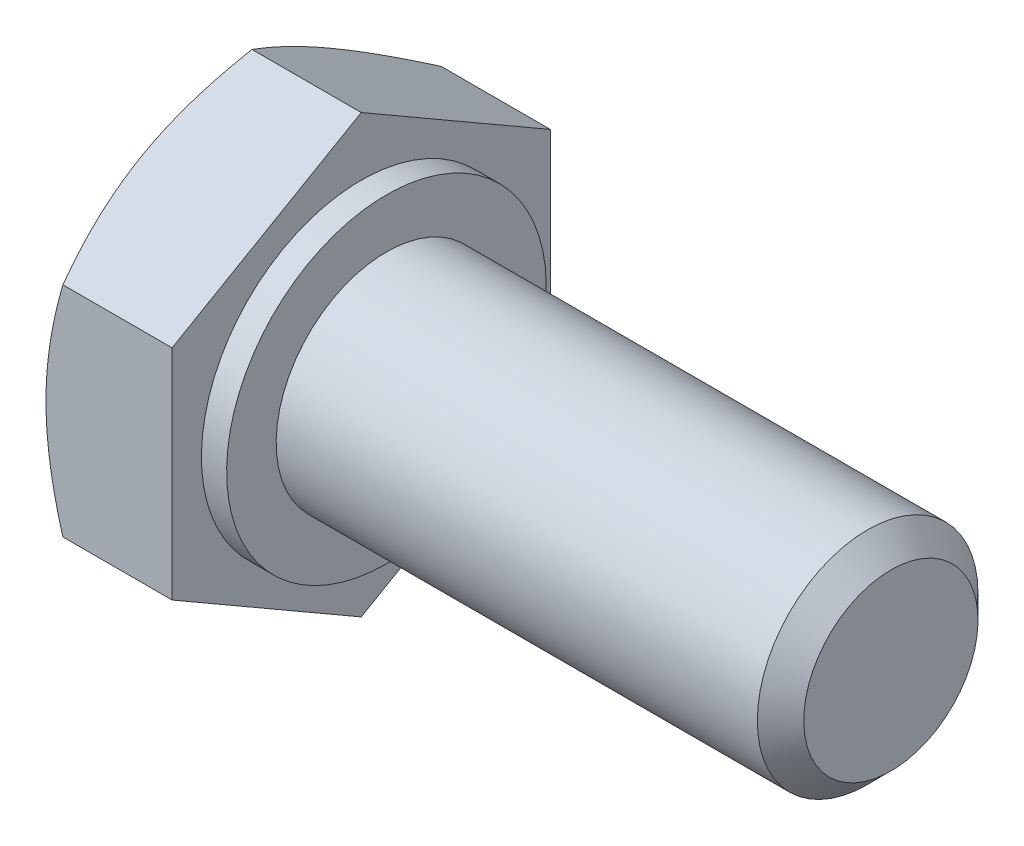
ISO-10303-21;
HEADER;
FILE_DESCRIPTION(('STEP AP214'),'2;1');
FILE_NAME('part.step','',(''),(''),'','','');
FILE_SCHEMA(('AUTOMOTIVE_DESIGN { 1 0 10303 214 1 1 1 1 }'));
ENDSEC;
DATA;
#1=APPLICATION_CONTEXT('core data for automotive mechanical design processes');
#2=APPLICATION_PROTOCOL_DEFINITION('international standard','automotive_design',2000,#1);
#3=PRODUCT_CONTEXT('',#1,'mechanical');
#4=PRODUCT('Part','Part','',(#3));
#5=PRODUCT_RELATED_PRODUCT_CATEGORY('part','',(#4));
#6=PRODUCT_DEFINITION_FORMATION('','',#4);
#7=PRODUCT_DEFINITION_CONTEXT('part definition',#1,'design');
#8=PRODUCT_DEFINITION('design','',#6,#7);
#9=PRODUCT_DEFINITION_SHAPE('','',#8);
#10=(LENGTH_UNIT() NAMED_UNIT(*) SI_UNIT(.MILLI.,.METRE.));
#11=(NAMED_UNIT(*) PLANE_ANGLE_UNIT() SI_UNIT($,.RADIAN.));
#12=(NAMED_UNIT(*) SI_UNIT($,.STERADIAN.) SOLID_ANGLE_UNIT());
#13=UNCERTAINTY_MEASURE_WITH_UNIT(LENGTH_MEASURE(1.E-05),#10,'distance_accuracy_value','');
#14=(GEOMETRIC_REPRESENTATION_CONTEXT(3) GLOBAL_UNCERTAINTY_ASSIGNED_CONTEXT((#13)) GLOBAL_UNIT_ASSIGNED_CONTEXT((#10,
#11,#12)) REPRESENTATION_CONTEXT('',''));
#15=CARTESIAN_POINT('',(0.,0.,0.));
#16=DIRECTION('',(0.,0.,1.));
#17=DIRECTION('',(1.,0.,0.));
#18=AXIS2_PLACEMENT_3D('',#15,#16,#17);
#19=CARTESIAN_POINT('',(0.,2.1425,0.));
#20=DIRECTION('',(1.,0.,0.));
#21=DIRECTION('',(0.,1.,0.));
#22=AXIS2_PLACEMENT_3D('',#19,#20,#21);
#23=PLANE('',#22);
#24=CARTESIAN_POINT('',(0.,0.,0.));
#25=DIRECTION('',(1.,0.,0.));
#26=DIRECTION('',(0.,1.,0.));
#27=AXIS2_PLACEMENT_3D('',#24,#25,#26);
#28=CIRCLE('',#27,1.75);
#29=CARTESIAN_POINT('',(0.,-1.75,0.));
#30=VERTEX_POINT('',#29);
#31=EDGE_CURVE('E218',#30,#30,#28,.T.);
#32=ORIENTED_EDGE('',*,*,#31,.F.);
#33=EDGE_LOOP('',(#32));
#34=FACE_BOUND('',#33,.T.);
#35=CARTESIAN_POINT('',(0.,0.,0.));
#36=DIRECTION('',(1.,0.,0.));
#37=DIRECTION('',(0.,1.,0.));
#38=AXIS2_PLACEMENT_3D('',#35,#36,#37);
#39=CIRCLE('',#38,2.535);
#40=CARTESIAN_POINT('',(0.,-2.535,0.));
#41=VERTEX_POINT('',#40);
#42=EDGE_CURVE('E28',#41,#41,#39,.T.);
#43=ORIENTED_EDGE('',*,*,#42,.T.);
#44=EDGE_LOOP('',(#43));
#45=FACE_BOUND('',#44,.T.);
#46=ADVANCED_FACE('F17',(#34,#45),#23,.T.);
#47=CARTESIAN_POINT('',(-0.200049999999994,0.,0.));
#48=DIRECTION('',(1.,0.,0.));
#49=DIRECTION('',(0.,1.,0.));
#50=AXIS2_PLACEMENT_3D('',#47,#48,#49);
#51=CYLINDRICAL_SURFACE('',#50,2.535);
#52=ORIENTED_EDGE('',*,*,#42,.F.);
#53=DIRECTION('',(-1.,0.,0.));
#54=VECTOR('',#53,1.);
#55=CARTESIAN_POINT('',(-0.200049999999994,-2.535,0.));
#56=LINE('',#55,#54);
#57=CARTESIAN_POINT('',(-0.400099999999995,-2.535,0.));
#58=VERTEX_POINT('',#57);
#59=EDGE_CURVE('E11',#41,#58,#56,.T.);
#60=ORIENTED_EDGE('',*,*,#59,.T.);
#61=CARTESIAN_POINT('',(-0.400099999999994,0.,0.));
#62=DIRECTION('',(1.,0.,0.));
#63=DIRECTION('',(0.,1.,0.));
#64=AXIS2_PLACEMENT_3D('',#61,#62,#63);
#65=CIRCLE('',#64,2.535);
#66=EDGE_CURVE('E206',#58,#58,#65,.T.);
#67=ORIENTED_EDGE('',*,*,#66,.T.);
#68=ORIENTED_EDGE('',*,*,#59,.F.);
#69=EDGE_LOOP('',(#52,#60,#67,#68));
#70=FACE_BOUND('',#69,.T.);
#71=ADVANCED_FACE('F390',(#70),#51,.T.);
#72=CARTESIAN_POINT('',(-2.4001,0.,0.));
#73=DIRECTION('',(1.,0.,0.));
#74=DIRECTION('',(0.,1.,0.));
#75=AXIS2_PLACEMENT_3D('',#72,#73,#74);
#76=PLANE('',#75);
#77=CARTESIAN_POINT('',(-2.4001,0.,0.));
#78=DIRECTION('',(-1.,0.,0.));
#79=DIRECTION('',(0.,1.,0.));
#80=AXIS2_PLACEMENT_3D('',#77,#78,#79);
#81=CIRCLE('',#80,3.);
#82=CARTESIAN_POINT('',(-2.4001,0.,3.));
#83=VERTEX_POINT('',#82);
#84=CARTESIAN_POINT('',(-2.4001,2.59807621135331,1.5));
#85=VERTEX_POINT('',#84);
#86=EDGE_CURVE('E303',#83,#85,#81,.T.);
#87=ORIENTED_EDGE('',*,*,#86,.T.);
#88=CARTESIAN_POINT('',(-2.4001,0.,0.));
#89=DIRECTION('',(-1.,0.,0.));
#90=DIRECTION('',(0.,1.,0.));
#91=AXIS2_PLACEMENT_3D('',#88,#89,#90);
#92=CIRCLE('',#91,3.);
#93=CARTESIAN_POINT('',(-2.4001,2.59807621135331,-1.5));
#94=VERTEX_POINT('',#93);
#95=EDGE_CURVE('E243',#85,#94,#92,.T.);
#96=ORIENTED_EDGE('',*,*,#95,.T.);
#97=CARTESIAN_POINT('',(-2.4001,0.,0.));
#98=DIRECTION('',(-1.,0.,0.));
#99=DIRECTION('',(0.,1.,0.));
#100=AXIS2_PLACEMENT_3D('',#97,#98,#99);
#101=CIRCLE('',#100,3.);
#102=CARTESIAN_POINT('',(-2.4001,0.,-3.));
#103=VERTEX_POINT('',#102);
#104=EDGE_CURVE('E250',#94,#103,#101,.T.);
#105=ORIENTED_EDGE('',*,*,#104,.T.);
#106=CARTESIAN_POINT('',(-2.4001,0.,0.));
#107=DIRECTION('',(-1.,0.,0.));
#108=DIRECTION('',(0.,1.,0.));
#109=AXIS2_PLACEMENT_3D('',#106,#107,#108);
#110=CIRCLE('',#109,3.);
#111=CARTESIAN_POINT('',(-2.4001,-2.59807621135331,-1.5));
#112=VERTEX_POINT('',#111);
#113=EDGE_CURVE('E137',#103,#112,#110,.T.);
#114=ORIENTED_EDGE('',*,*,#113,.T.);
#115=CARTESIAN_POINT('',(-2.4001,0.,0.));
#116=DIRECTION('',(-1.,0.,0.));
#117=DIRECTION('',(0.,1.,0.));
#118=AXIS2_PLACEMENT_3D('',#115,#116,#117);
#119=CIRCLE('',#118,3.);
#120=CARTESIAN_POINT('',(-2.4001,-2.59807621135331,1.5));
#121=VERTEX_POINT('',#120);
#122=EDGE_CURVE('E232',#112,#121,#119,.T.);
#123=ORIENTED_EDGE('',*,*,#122,.T.);
#124=CARTESIAN_POINT('',(-2.4001,0.,0.));
#125=DIRECTION('',(-1.,0.,0.));
#126=DIRECTION('',(0.,1.,0.));
#127=AXIS2_PLACEMENT_3D('',#124,#125,#126);
#128=CIRCLE('',#127,3.);
#129=EDGE_CURVE('E244',#121,#83,#128,.T.);
#130=ORIENTED_EDGE('',*,*,#129,.T.);
#131=EDGE_LOOP('',(#87,#96,#105,#114,#123,#130));
#132=FACE_BOUND('',#131,.T.);
#133=ADVANCED_FACE('F368',(#132),#76,.F.);
#134=CARTESIAN_POINT('',(-0.400099999999993,-3.46410161513775,0.));
#135=DIRECTION('',(0.,-0.866025403784438,-0.5));
#136=DIRECTION('',(0.,0.5,-0.866025403784439));
#137=AXIS2_PLACEMENT_3D('',#134,#135,#136);
#138=PLANE('',#137);
#139=CARTESIAN_POINT('',(-2.4001,-2.59807621135331,-1.5));
#140=CARTESIAN_POINT('',(-2.40010000000001,-2.19615242270664,-2.19615242270662));
#141=CARTESIAN_POINT('',(-2.1321508075689,-1.73205080756889,-3.));
#142=(BOUNDED_CURVE() B_SPLINE_CURVE(2,(#139,#140,#141),.UNSPECIFIED.,.F.,
.F.) B_SPLINE_CURVE_WITH_KNOTS((3,3),(0.17571291563257,0.35142583126514),
.UNSPECIFIED.) CURVE() GEOMETRIC_REPRESENTATION_ITEM() RATIONAL_B_SPLINE_CURVE((1.,
1.03795484930203,1.)) REPRESENTATION_ITEM(''));
#143=CARTESIAN_POINT('',(-2.1321508075689,-1.73205080756889,-3.));
#144=VERTEX_POINT('',#143);
#145=EDGE_CURVE('E298',#112,#144,#142,.T.);
#146=ORIENTED_EDGE('',*,*,#145,.T.);
#147=DIRECTION('',(-1.,0.,0.));
#148=VECTOR('',#147,1.);
#149=CARTESIAN_POINT('',(-0.400099999999993,-1.73205080756887,-3.));
#150=LINE('',#149,#148);
#151=CARTESIAN_POINT('',(-0.400099999999993,-1.73205080756887,-3.));
#152=VERTEX_POINT('',#151);
#153=EDGE_CURVE('E204',#152,#144,#150,.T.);
#154=ORIENTED_EDGE('',*,*,#153,.F.);
#155=DIRECTION('',(0.,0.5,-0.866025403784438));
#156=VECTOR('',#155,1.);
#157=CARTESIAN_POINT('',(-0.400099999999993,-3.46410161513775,0.));
#158=LINE('',#157,#156);
#159=CARTESIAN_POINT('',(-0.400099999999993,-3.46410161513775,0.));
#160=VERTEX_POINT('',#159);
#161=EDGE_CURVE('E256',#160,#152,#158,.T.);
#162=ORIENTED_EDGE('',*,*,#161,.F.);
#163=DIRECTION('',(-1.,0.,0.));
#164=VECTOR('',#163,1.);
#165=CARTESIAN_POINT('',(-0.400099999999993,-3.46410161513775,0.));
#166=LINE('',#165,#164);
#167=CARTESIAN_POINT('',(-2.1321508075689,-3.46410161513774,0.));
#168=VERTEX_POINT('',#167);
#169=EDGE_CURVE('E127',#160,#168,#166,.T.);
#170=ORIENTED_EDGE('',*,*,#169,.T.);
#171=CARTESIAN_POINT('',(-2.1321508075689,-3.46410161513774,0.));
#172=CARTESIAN_POINT('',(-2.40010000000001,-2.99999999999999,-0.803847577293378));
#173=CARTESIAN_POINT('',(-2.4001,-2.59807621135331,-1.5));
#174=(BOUNDED_CURVE() B_SPLINE_CURVE(2,(#171,#172,#173),.UNSPECIFIED.,.F.,
.F.) B_SPLINE_CURVE_WITH_KNOTS((3,3),(0.,0.17571291563257),
.UNSPECIFIED.) CURVE() GEOMETRIC_REPRESENTATION_ITEM() RATIONAL_B_SPLINE_CURVE((1.,
1.03795484930203,1.)) REPRESENTATION_ITEM(''));
#175=EDGE_CURVE('E233',#168,#112,#174,.T.);
#176=ORIENTED_EDGE('',*,*,#175,.T.);
#177=EDGE_LOOP('',(#146,#154,#162,#170,#176));
#178=FACE_BOUND('',#177,.T.);
#179=ADVANCED_FACE('F19',(#178),#138,.T.);
#180=CARTESIAN_POINT('',(-0.400099999999993,-1.73205080756888,3.));
#181=DIRECTION('',(0.,-0.866025403784439,0.5));
#182=DIRECTION('',(-1.,0.,0.));
#183=AXIS2_PLACEMENT_3D('',#180,#181,#182);
#184=PLANE('',#183);
#185=CARTESIAN_POINT('',(-2.4001,-2.59807621135331,1.5));
#186=CARTESIAN_POINT('',(-2.40010000000001,-2.99999999999999,0.803847577293377));
#187=CARTESIAN_POINT('',(-2.1321508075689,-3.46410161513774,0.));
#188=(BOUNDED_CURVE() B_SPLINE_CURVE(2,(#185,#186,#187),.UNSPECIFIED.,.F.,
.F.) B_SPLINE_CURVE_WITH_KNOTS((3,3),(0.17571291563257,0.35142583126514),
.UNSPECIFIED.) CURVE() GEOMETRIC_REPRESENTATION_ITEM() RATIONAL_B_SPLINE_CURVE((1.,
1.03795484930203,1.)) REPRESENTATION_ITEM(''));
#189=EDGE_CURVE('E228',#121,#168,#188,.T.);
#190=ORIENTED_EDGE('',*,*,#189,.T.);
#191=ORIENTED_EDGE('',*,*,#169,.F.);
#192=DIRECTION('',(0.,-0.5,-0.866025403784439));
#193=VECTOR('',#192,1.);
#194=CARTESIAN_POINT('',(-0.400099999999993,-1.73205080756888,3.));
#195=LINE('',#194,#193);
#196=CARTESIAN_POINT('',(-0.400099999999993,-1.73205080756888,3.));
#197=VERTEX_POINT('',#196);
#198=EDGE_CURVE('E21',#197,#160,#195,.T.);
#199=ORIENTED_EDGE('',*,*,#198,.F.);
#200=DIRECTION('',(-1.,0.,0.));
#201=VECTOR('',#200,1.);
#202=CARTESIAN_POINT('',(-0.400099999999993,-1.73205080756888,3.));
#203=LINE('',#202,#201);
#204=CARTESIAN_POINT('',(-2.1321508075689,-1.73205080756885,3.));
#205=VERTEX_POINT('',#204);
#206=EDGE_CURVE('E146',#197,#205,#203,.T.);
#207=ORIENTED_EDGE('',*,*,#206,.T.);
#208=CARTESIAN_POINT('',(-2.1321508075689,-1.73205080756889,3.));
#209=CARTESIAN_POINT('',(-2.40010000000001,-2.19615242270664,2.19615242270662));
#210=CARTESIAN_POINT('',(-2.4001,-2.59807621135331,1.5));
#211=(BOUNDED_CURVE() B_SPLINE_CURVE(2,(#208,#209,#210),.UNSPECIFIED.,.F.,
.F.) B_SPLINE_CURVE_WITH_KNOTS((3,3),(0.,0.17571291563257),
.UNSPECIFIED.) CURVE() GEOMETRIC_REPRESENTATION_ITEM() RATIONAL_B_SPLINE_CURVE((1.,
1.03795484930203,1.)) REPRESENTATION_ITEM(''));
#212=EDGE_CURVE('E186',#205,#121,#211,.T.);
#213=ORIENTED_EDGE('',*,*,#212,.T.);
#214=EDGE_LOOP('',(#190,#191,#199,#207,#213));
#215=FACE_BOUND('',#214,.T.);
#216=ADVANCED_FACE('F349',(#215),#184,.T.);
#217=CARTESIAN_POINT('',(-0.400099999999994,1.73205080756887,3.));
#218=DIRECTION('',(0.,0.,1.));
#219=DIRECTION('',(0.,-1.,0.));
#220=AXIS2_PLACEMENT_3D('',#217,#218,#219);
#221=PLANE('',#220);
#222=CARTESIAN_POINT('',(-2.4001,0.,3.));
#223=CARTESIAN_POINT('',(-2.40010000000001,-0.803847577293359,3.));
#224=CARTESIAN_POINT('',(-2.1321508075689,-1.73205080756885,3.));
#225=(BOUNDED_CURVE() B_SPLINE_CURVE(2,(#222,#223,#224),.UNSPECIFIED.,.F.,
.F.) B_SPLINE_CURVE_WITH_KNOTS((3,3),(0.17571291563257,0.35142583126514),
.UNSPECIFIED.) CURVE() GEOMETRIC_REPRESENTATION_ITEM() RATIONAL_B_SPLINE_CURVE((1.,
1.03795484930204,1.)) REPRESENTATION_ITEM(''));
#226=EDGE_CURVE('E190',#83,#205,#225,.T.);
#227=ORIENTED_EDGE('',*,*,#226,.T.);
#228=ORIENTED_EDGE('',*,*,#206,.F.);
#229=DIRECTION('',(0.,-1.,0.));
#230=VECTOR('',#229,1.);
#231=CARTESIAN_POINT('',(-0.400099999999994,1.73205080756887,3.));
#232=LINE('',#231,#230);
#233=CARTESIAN_POINT('',(-0.400099999999994,1.73205080756887,3.));
#234=VERTEX_POINT('',#233);
#235=EDGE_CURVE('E151',#234,#197,#232,.T.);
#236=ORIENTED_EDGE('',*,*,#235,.F.);
#237=DIRECTION('',(-1.,0.,0.));
#238=VECTOR('',#237,1.);
#239=CARTESIAN_POINT('',(-0.400099999999994,1.73205080756887,3.));
#240=LINE('',#239,#238);
#241=CARTESIAN_POINT('',(-2.1321508075689,1.73205080756884,3.));
#242=VERTEX_POINT('',#241);
#243=EDGE_CURVE('E156',#234,#242,#240,.T.);
#244=ORIENTED_EDGE('',*,*,#243,.T.);
#245=CARTESIAN_POINT('',(-2.1321508075689,1.73205080756884,3.));
#246=CARTESIAN_POINT('',(-2.40010000000001,0.803847577293353,3.));
#247=CARTESIAN_POINT('',(-2.4001,0.,3.));
#248=(BOUNDED_CURVE() B_SPLINE_CURVE(2,(#245,#246,#247),.UNSPECIFIED.,.F.,
.F.) B_SPLINE_CURVE_WITH_KNOTS((3,3),(0.,0.17571291563257),
.UNSPECIFIED.) CURVE() GEOMETRIC_REPRESENTATION_ITEM() RATIONAL_B_SPLINE_CURVE((1.,
1.03795484930205,1.)) REPRESENTATION_ITEM(''));
#249=EDGE_CURVE('E191',#242,#83,#248,.T.);
#250=ORIENTED_EDGE('',*,*,#249,.T.);
#251=EDGE_LOOP('',(#227,#228,#236,#244,#250));
#252=FACE_BOUND('',#251,.T.);
#253=ADVANCED_FACE('F153',(#252),#221,.T.);
#254=CARTESIAN_POINT('',(-0.400099999999993,0.,0.));
#255=DIRECTION('',(1.,0.,0.));
#256=DIRECTION('',(0.,1.,0.));
#257=AXIS2_PLACEMENT_3D('',#254,#255,#256);
#258=PLANE('',#257);
#259=ORIENTED_EDGE('',*,*,#66,.F.);
#260=EDGE_LOOP('',(#259));
#261=FACE_BOUND('',#260,.T.);
#262=DIRECTION('',(0.,-0.5,0.866025403784438));
#263=VECTOR('',#262,1.);
#264=CARTESIAN_POINT('',(-0.400099999999994,3.46410161513775,0.));
#265=LINE('',#264,#263);
#266=CARTESIAN_POINT('',(-0.400099999999994,3.46410161513775,0.));
#267=VERTEX_POINT('',#266);
#268=EDGE_CURVE('E161',#267,#234,#265,.T.);
#269=ORIENTED_EDGE('',*,*,#268,.T.);
#270=ORIENTED_EDGE('',*,*,#235,.T.);
#271=ORIENTED_EDGE('',*,*,#198,.T.);
#272=ORIENTED_EDGE('',*,*,#161,.T.);
#273=DIRECTION('',(0.,1.,0.));
#274=VECTOR('',#273,1.);
#275=CARTESIAN_POINT('',(-0.400099999999993,-1.73205080756887,-3.));
#276=LINE('',#275,#274);
#277=CARTESIAN_POINT('',(-0.400099999999994,1.73205080756888,-3.));
#278=VERTEX_POINT('',#277);
#279=EDGE_CURVE('E257',#152,#278,#276,.T.);
#280=ORIENTED_EDGE('',*,*,#279,.T.);
#281=DIRECTION('',(0.,0.5,0.866025403784439));
#282=VECTOR('',#281,1.);
#283=CARTESIAN_POINT('',(-0.400099999999994,1.73205080756888,-3.));
#284=LINE('',#283,#282);
#285=EDGE_CURVE('E166',#278,#267,#284,.T.);
#286=ORIENTED_EDGE('',*,*,#285,.T.);
#287=EDGE_LOOP('',(#269,#270,#271,#272,#280,#286));
#288=FACE_BOUND('',#287,.T.);
#289=ADVANCED_FACE('F164',(#261,#288),#258,.T.);
#290=CARTESIAN_POINT('',(-0.400099999999994,3.46410161513775,0.));
#291=DIRECTION('',(0.,0.866025403784438,0.5));
#292=DIRECTION('',(1.,0.,0.));
#293=AXIS2_PLACEMENT_3D('',#290,#291,#292);
#294=PLANE('',#293);
#295=CARTESIAN_POINT('',(-2.1321508075689,3.46410161513774,0.));
#296=CARTESIAN_POINT('',(-2.40010000000001,2.99999999999999,0.803847577293379));
#297=CARTESIAN_POINT('',(-2.4001,2.59807621135331,1.5));
#298=(BOUNDED_CURVE() B_SPLINE_CURVE(2,(#295,#296,#297),.UNSPECIFIED.,.F.,
.F.) B_SPLINE_CURVE_WITH_KNOTS((3,3),(0.,0.17571291563257),
.UNSPECIFIED.) CURVE() GEOMETRIC_REPRESENTATION_ITEM() RATIONAL_B_SPLINE_CURVE((1.,
1.03795484930203,1.)) REPRESENTATION_ITEM(''));
#299=CARTESIAN_POINT('',(-2.1321508075689,3.46410161513774,0.));
#300=VERTEX_POINT('',#299);
#301=EDGE_CURVE('E261',#300,#85,#298,.T.);
#302=ORIENTED_EDGE('',*,*,#301,.T.);
#303=CARTESIAN_POINT('',(-2.4001,2.59807621135331,1.5));
#304=CARTESIAN_POINT('',(-2.40010000000001,2.19615242270663,2.19615242270662));
#305=CARTESIAN_POINT('',(-2.1321508075689,1.73205080756889,3.));
#306=(BOUNDED_CURVE() B_SPLINE_CURVE(2,(#303,#304,#305),.UNSPECIFIED.,.F.,
.F.) B_SPLINE_CURVE_WITH_KNOTS((3,3),(0.17571291563257,0.35142583126514),
.UNSPECIFIED.) CURVE() GEOMETRIC_REPRESENTATION_ITEM() RATIONAL_B_SPLINE_CURVE((1.,
1.03795484930204,1.)) REPRESENTATION_ITEM(''));
#307=EDGE_CURVE('E172',#85,#242,#306,.T.);
#308=ORIENTED_EDGE('',*,*,#307,.T.);
#309=ORIENTED_EDGE('',*,*,#243,.F.);
#310=ORIENTED_EDGE('',*,*,#268,.F.);
#311=DIRECTION('',(-1.,0.,0.));
#312=VECTOR('',#311,1.);
#313=CARTESIAN_POINT('',(-0.400099999999994,3.46410161513775,0.));
#314=LINE('',#313,#312);
#315=EDGE_CURVE('E119',#267,#300,#314,.T.);
#316=ORIENTED_EDGE('',*,*,#315,.T.);
#317=EDGE_LOOP('',(#302,#308,#309,#310,#316));
#318=FACE_BOUND('',#317,.T.);
#319=ADVANCED_FACE('F170',(#318),#294,.T.);
#320=CARTESIAN_POINT('',(-0.400099999999994,1.73205080756888,-3.));
#321=DIRECTION('',(0.,0.866025403784439,-0.5));
#322=DIRECTION('',(-1.,0.,0.));
#323=AXIS2_PLACEMENT_3D('',#320,#321,#322);
#324=PLANE('',#323);
#325=CARTESIAN_POINT('',(-2.1321508075689,1.73205080756889,-3.));
#326=CARTESIAN_POINT('',(-2.40010000000001,2.19615242270664,-2.19615242270662));
#327=CARTESIAN_POINT('',(-2.4001,2.59807621135331,-1.5));
#328=(BOUNDED_CURVE() B_SPLINE_CURVE(2,(#325,#326,#327),.UNSPECIFIED.,.F.,
.F.) B_SPLINE_CURVE_WITH_KNOTS((3,3),(0.,0.17571291563257),
.UNSPECIFIED.) CURVE() GEOMETRIC_REPRESENTATION_ITEM() RATIONAL_B_SPLINE_CURVE((1.,
1.03795484930204,1.)) REPRESENTATION_ITEM(''));
#329=CARTESIAN_POINT('',(-2.1321508075689,1.73205080756885,-3.));
#330=VERTEX_POINT('',#329);
#331=EDGE_CURVE('E182',#330,#94,#328,.T.);
#332=ORIENTED_EDGE('',*,*,#331,.T.);
#333=CARTESIAN_POINT('',(-2.4001,2.59807621135331,-1.5));
#334=CARTESIAN_POINT('',(-2.40010000000001,2.99999999999999,-0.803847577293378));
#335=CARTESIAN_POINT('',(-2.1321508075689,3.46410161513774,0.));
#336=(BOUNDED_CURVE() B_SPLINE_CURVE(2,(#333,#334,#335),.UNSPECIFIED.,.F.,
.F.) B_SPLINE_CURVE_WITH_KNOTS((3,3),(0.17571291563257,0.35142583126514),
.UNSPECIFIED.) CURVE() GEOMETRIC_REPRESENTATION_ITEM() RATIONAL_B_SPLINE_CURVE((1.,
1.03795484930204,1.)) REPRESENTATION_ITEM(''));
#337=EDGE_CURVE('E234',#94,#300,#336,.T.);
#338=ORIENTED_EDGE('',*,*,#337,.T.);
#339=ORIENTED_EDGE('',*,*,#315,.F.);
#340=ORIENTED_EDGE('',*,*,#285,.F.);
#341=DIRECTION('',(-1.,0.,0.));
#342=VECTOR('',#341,1.);
#343=CARTESIAN_POINT('',(-0.400099999999994,1.73205080756888,-3.));
#344=LINE('',#343,#342);
#345=EDGE_CURVE('E260',#278,#330,#344,.T.);
#346=ORIENTED_EDGE('',*,*,#345,.T.);
#347=EDGE_LOOP('',(#332,#338,#339,#340,#346));
#348=FACE_BOUND('',#347,.T.);
#349=ADVANCED_FACE('F361',(#348),#324,.T.);
#350=CARTESIAN_POINT('',(-0.400099999999993,-1.73205080756887,-3.));
#351=DIRECTION('',(0.,0.,-1.));
#352=DIRECTION('',(-1.,0.,0.));
#353=AXIS2_PLACEMENT_3D('',#350,#351,#352);
#354=PLANE('',#353);
#355=CARTESIAN_POINT('',(-2.1321508075689,-1.73205080756885,-3.));
#356=CARTESIAN_POINT('',(-2.40010000000001,-0.803847577293356,-3.));
#357=CARTESIAN_POINT('',(-2.4001,0.,-3.));
#358=(BOUNDED_CURVE() B_SPLINE_CURVE(2,(#355,#356,#357),.UNSPECIFIED.,.F.,
.F.) B_SPLINE_CURVE_WITH_KNOTS((3,3),(0.,0.17571291563257),
.UNSPECIFIED.) CURVE() GEOMETRIC_REPRESENTATION_ITEM() RATIONAL_B_SPLINE_CURVE((1.,
1.03795484930204,1.)) REPRESENTATION_ITEM(''));
#359=EDGE_CURVE('E311',#144,#103,#358,.T.);
#360=ORIENTED_EDGE('',*,*,#359,.T.);
#361=CARTESIAN_POINT('',(-2.4001,0.,-3.));
#362=CARTESIAN_POINT('',(-2.40010000000001,0.803847577293357,-3.));
#363=CARTESIAN_POINT('',(-2.1321508075689,1.73205080756885,-3.));
#364=(BOUNDED_CURVE() B_SPLINE_CURVE(2,(#361,#362,#363),.UNSPECIFIED.,.F.,
.F.) B_SPLINE_CURVE_WITH_KNOTS((3,3),(0.17571291563257,0.35142583126514),
.UNSPECIFIED.) CURVE() GEOMETRIC_REPRESENTATION_ITEM() RATIONAL_B_SPLINE_CURVE((1.,
1.03795484930205,1.)) REPRESENTATION_ITEM(''));
#365=EDGE_CURVE('E253',#103,#330,#364,.T.);
#366=ORIENTED_EDGE('',*,*,#365,.T.);
#367=ORIENTED_EDGE('',*,*,#345,.F.);
#368=ORIENTED_EDGE('',*,*,#279,.F.);
#369=ORIENTED_EDGE('',*,*,#153,.T.);
#370=EDGE_LOOP('',(#360,#366,#367,#368,#369));
#371=FACE_BOUND('',#370,.T.);
#372=ADVANCED_FACE('F357',(#371),#354,.T.);
#373=CARTESIAN_POINT('',(-2.26612540378445,0.,0.));
#374=DIRECTION('',(1.,0.,0.));
#375=DIRECTION('',(0.,1.,0.));
#376=AXIS2_PLACEMENT_3D('',#373,#374,#375);
#377=CONICAL_SURFACE('',#376,3.23205080756887,1.0471975511966);
#378=ORIENTED_EDGE('',*,*,#359,.F.);
#379=ORIENTED_EDGE('',*,*,#145,.F.);
#380=ORIENTED_EDGE('',*,*,#113,.F.);
#381=EDGE_LOOP('',(#378,#379,#380));
#382=FACE_BOUND('',#381,.T.);
#383=ADVANCED_FACE('F407',(#382),#377,.T.);
#384=CARTESIAN_POINT('',(-2.26612540378445,0.,0.));
#385=DIRECTION('',(1.,0.,0.));
#386=DIRECTION('',(0.,1.,0.));
#387=AXIS2_PLACEMENT_3D('',#384,#385,#386);
#388=CONICAL_SURFACE('',#387,3.23205080756887,1.0471975511966);
#389=ORIENTED_EDGE('',*,*,#365,.F.);
#390=ORIENTED_EDGE('',*,*,#104,.F.);
#391=ORIENTED_EDGE('',*,*,#331,.F.);
#392=EDGE_LOOP('',(#389,#390,#391));
#393=FACE_BOUND('',#392,.T.);
#394=ADVANCED_FACE('F364',(#393),#388,.T.);
#395=CARTESIAN_POINT('',(-2.26612540378445,0.,0.));
#396=DIRECTION('',(1.,0.,0.));
#397=DIRECTION('',(0.,-1.,0.));
#398=AXIS2_PLACEMENT_3D('',#395,#396,#397);
#399=CONICAL_SURFACE('',#398,3.23205080756887,1.0471975511966);
#400=ORIENTED_EDGE('',*,*,#175,.F.);
#401=ORIENTED_EDGE('',*,*,#189,.F.);
#402=ORIENTED_EDGE('',*,*,#122,.F.);
#403=EDGE_LOOP('',(#400,#401,#402));
#404=FACE_BOUND('',#403,.T.);
#405=ADVANCED_FACE('F375',(#404),#399,.T.);
#406=CARTESIAN_POINT('',(-2.26612540378445,0.,0.));
#407=DIRECTION('',(1.,0.,0.));
#408=DIRECTION('',(0.,1.,0.));
#409=AXIS2_PLACEMENT_3D('',#406,#407,#408);
#410=CONICAL_SURFACE('',#409,3.23205080756887,1.0471975511966);
#411=ORIENTED_EDGE('',*,*,#337,.F.);
#412=ORIENTED_EDGE('',*,*,#95,.F.);
#413=ORIENTED_EDGE('',*,*,#301,.F.);
#414=EDGE_LOOP('',(#411,#412,#413));
#415=FACE_BOUND('',#414,.T.);
#416=ADVANCED_FACE('F372',(#415),#410,.T.);
#417=CARTESIAN_POINT('',(-2.26612540378445,0.,0.));
#418=DIRECTION('',(1.,0.,0.));
#419=DIRECTION('',(0.,1.,0.));
#420=AXIS2_PLACEMENT_3D('',#417,#418,#419);
#421=CONICAL_SURFACE('',#420,3.23205080756887,1.0471975511966);
#422=ORIENTED_EDGE('',*,*,#212,.F.);
#423=ORIENTED_EDGE('',*,*,#226,.F.);
#424=ORIENTED_EDGE('',*,*,#129,.F.);
#425=EDGE_LOOP('',(#422,#423,#424));
#426=FACE_BOUND('',#425,.T.);
#427=ADVANCED_FACE('F374',(#426),#421,.T.);
#428=CARTESIAN_POINT('',(-2.26612540378445,0.,0.));
#429=DIRECTION('',(1.,0.,0.));
#430=DIRECTION('',(0.,1.,0.));
#431=AXIS2_PLACEMENT_3D('',#428,#429,#430);
#432=CONICAL_SURFACE('',#431,3.23205080756887,1.0471975511966);
#433=ORIENTED_EDGE('',*,*,#307,.F.);
#434=ORIENTED_EDGE('',*,*,#86,.F.);
#435=ORIENTED_EDGE('',*,*,#249,.F.);
#436=EDGE_LOOP('',(#433,#434,#435));
#437=FACE_BOUND('',#436,.T.);
#438=ADVANCED_FACE('F382',(#437),#432,.T.);
#439=CARTESIAN_POINT('',(8.,0.875,0.));
#440=DIRECTION('',(1.,0.,0.));
#441=DIRECTION('',(0.,1.,0.));
#442=AXIS2_PLACEMENT_3D('',#439,#440,#441);
#443=PLANE('',#442);
#444=CARTESIAN_POINT('',(8.,0.,0.));
#445=DIRECTION('',(-1.,0.,0.));
#446=DIRECTION('',(0.,-1.,0.));
#447=AXIS2_PLACEMENT_3D('',#444,#445,#446);
#448=CIRCLE('',#447,1.38193);
#449=CARTESIAN_POINT('',(8.,1.38193,0.));
#450=VERTEX_POINT('',#449);
#451=EDGE_CURVE('E201',#450,#450,#448,.T.);
#452=ORIENTED_EDGE('',*,*,#451,.F.);
#453=EDGE_LOOP('',(#452));
#454=FACE_BOUND('',#453,.T.);
#455=ADVANCED_FACE('F402',(#454),#443,.T.);
#456=CARTESIAN_POINT('',(4.9,0.,0.));
#457=DIRECTION('',(1.,0.,0.));
#458=DIRECTION('',(0.,1.,0.));
#459=AXIS2_PLACEMENT_3D('',#456,#457,#458);
#460=CYLINDRICAL_SURFACE('',#459,1.75);
#461=CARTESIAN_POINT('',(7.63183,0.,0.));
#462=DIRECTION('',(1.,0.,0.));
#463=DIRECTION('',(0.,-1.,0.));
#464=AXIS2_PLACEMENT_3D('',#461,#462,#463);
#465=CIRCLE('',#464,1.75);
#466=CARTESIAN_POINT('',(7.63183,1.75,0.));
#467=VERTEX_POINT('',#466);
#468=CARTESIAN_POINT('',(7.63183,-1.75,0.));
#469=VERTEX_POINT('',#468);
#470=EDGE_CURVE('E200',#467,#469,#465,.T.);
#471=ORIENTED_EDGE('',*,*,#470,.F.);
#472=CARTESIAN_POINT('',(7.63183,0.,0.));
#473=DIRECTION('',(1.,0.,0.));
#474=DIRECTION('',(0.,-1.,0.));
#475=AXIS2_PLACEMENT_3D('',#472,#473,#474);
#476=CIRCLE('',#475,1.75);
#477=EDGE_CURVE('E207',#469,#467,#476,.T.);
#478=ORIENTED_EDGE('',*,*,#477,.F.);
#479=DIRECTION('',(-1.,0.,0.));
#480=VECTOR('',#479,1.);
#481=CARTESIAN_POINT('',(4.9,-1.75,0.));
#482=LINE('',#481,#480);
#483=EDGE_CURVE('E209',#469,#30,#482,.T.);
#484=ORIENTED_EDGE('',*,*,#483,.T.);
#485=ORIENTED_EDGE('',*,*,#31,.T.);
#486=ORIENTED_EDGE('',*,*,#483,.F.);
#487=EDGE_LOOP('',(#471,#478,#484,#485,#486));
#488=FACE_BOUND('',#487,.T.);
#489=ADVANCED_FACE('F405',(#488),#460,.T.);
#490=CARTESIAN_POINT('',(7.815915,0.,0.));
#491=DIRECTION('',(-1.,0.,0.));
#492=DIRECTION('',(0.,-1.,0.));
#493=AXIS2_PLACEMENT_3D('',#490,#491,#492);
#494=CONICAL_SURFACE('',#493,1.565965,0.785262338123916);
#495=ORIENTED_EDGE('',*,*,#451,.T.);
#496=DIRECTION('',(-0.707202817635692,0.70701073169234,0.));
#497=VECTOR('',#496,1.);
#498=CARTESIAN_POINT('',(7.815915,1.565965,0.));
#499=LINE('',#498,#497);
#500=EDGE_CURVE('E196',#450,#467,#499,.T.);
#501=ORIENTED_EDGE('',*,*,#500,.T.);
#502=ORIENTED_EDGE('',*,*,#470,.T.);
#503=ORIENTED_EDGE('',*,*,#477,.T.);
#504=ORIENTED_EDGE('',*,*,#500,.F.);
#505=EDGE_LOOP('',(#495,#501,#502,#503,#504));
#506=FACE_BOUND('',#505,.T.);
#507=ADVANCED_FACE('F517',(#506),#494,.T.);
#508=CLOSED_SHELL('',(#46,#71,#133,#179,#216,#253,#289,#319,#349,#372,#383,#394,#405,#416,#427,
#438,#455,#489,#507));
#509=MANIFOLD_SOLID_BREP('B1',#508);
#510=ADVANCED_BREP_SHAPE_REPRESENTATION('',(#18,#509),#14);
#511=SHAPE_DEFINITION_REPRESENTATION(#9,#510);
ENDSEC;
END-ISO-10303-21;
